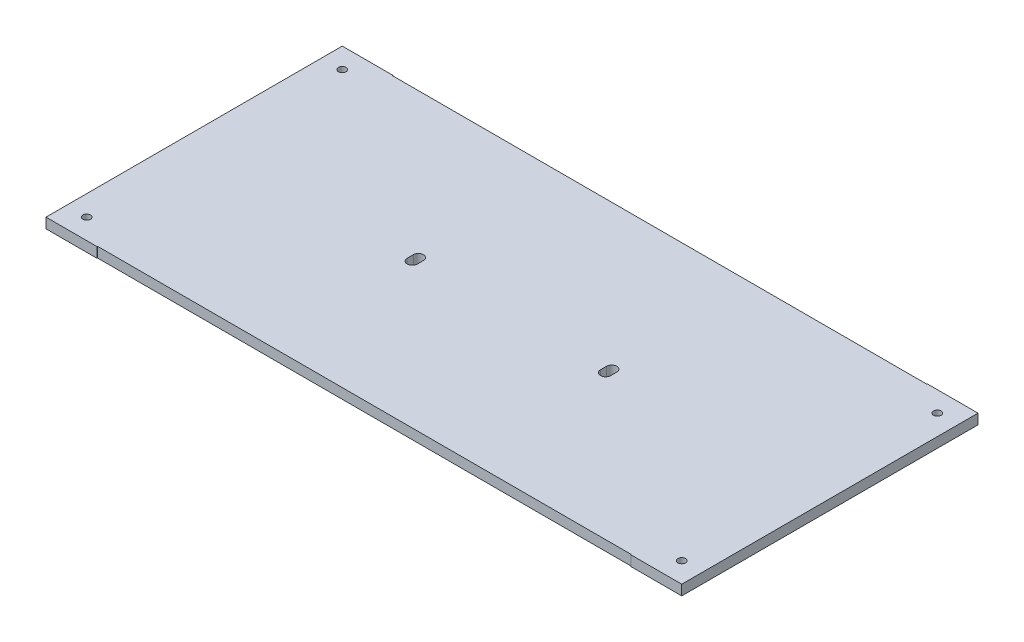
ISO-10303-21;
HEADER;
FILE_DESCRIPTION(('STEP AP214'),'2;1');
FILE_NAME('part.step','',(''),(''),'','','');
FILE_SCHEMA(('AUTOMOTIVE_DESIGN { 1 0 10303 214 1 1 1 1 }'));
ENDSEC;
DATA;
#1=APPLICATION_CONTEXT('core data for automotive mechanical design processes');
#2=APPLICATION_PROTOCOL_DEFINITION('international standard','automotive_design',2000,#1);
#3=PRODUCT_CONTEXT('',#1,'mechanical');
#4=PRODUCT('Part','Part','',(#3));
#5=PRODUCT_RELATED_PRODUCT_CATEGORY('part','',(#4));
#6=PRODUCT_DEFINITION_FORMATION('','',#4);
#7=PRODUCT_DEFINITION_CONTEXT('part definition',#1,'design');
#8=PRODUCT_DEFINITION('design','',#6,#7);
#9=PRODUCT_DEFINITION_SHAPE('','',#8);
#10=(LENGTH_UNIT() NAMED_UNIT(*) SI_UNIT(.MILLI.,.METRE.));
#11=(NAMED_UNIT(*) PLANE_ANGLE_UNIT() SI_UNIT($,.RADIAN.));
#12=(NAMED_UNIT(*) SI_UNIT($,.STERADIAN.) SOLID_ANGLE_UNIT());
#13=UNCERTAINTY_MEASURE_WITH_UNIT(LENGTH_MEASURE(1.E-05),#10,'distance_accuracy_value','');
#14=(GEOMETRIC_REPRESENTATION_CONTEXT(3) GLOBAL_UNCERTAINTY_ASSIGNED_CONTEXT((#13)) GLOBAL_UNIT_ASSIGNED_CONTEXT((#10,
#11,#12)) REPRESENTATION_CONTEXT('',''));
#15=CARTESIAN_POINT('',(0.,0.,0.));
#16=DIRECTION('',(0.,0.,1.));
#17=DIRECTION('',(1.,0.,0.));
#18=AXIS2_PLACEMENT_3D('',#15,#16,#17);
#19=CARTESIAN_POINT('',(250.,41.,-116.497422611929));
#20=DIRECTION('',(0.,-1.,0.));
#21=DIRECTION('',(0.,0.,-1.));
#22=AXIS2_PLACEMENT_3D('',#19,#20,#21);
#23=PLANE('',#22);
#24=DIRECTION('',(0.,0.,1.));
#25=VECTOR('',#24,1.);
#26=CARTESIAN_POINT('',(84.9999999999997,41.,-59.4487113059643));
#27=LINE('',#26,#25);
#28=CARTESIAN_POINT('',(84.9999999999997,41.,-59.4487113059643));
#29=VERTEX_POINT('',#28);
#30=CARTESIAN_POINT('',(84.9999999999997,41.,-57.0487113059643));
#31=VERTEX_POINT('',#30);
#32=EDGE_CURVE('E178',#29,#31,#27,.T.);
#33=ORIENTED_EDGE('',*,*,#32,.F.);
#34=CARTESIAN_POINT('',(86.9999999999997,41.,-59.4487113059643));
#35=DIRECTION('',(0.,-1.,0.));
#36=DIRECTION('',(0.,0.,-1.));
#37=AXIS2_PLACEMENT_3D('',#34,#35,#36);
#38=CIRCLE('',#37,2.00000000000001);
#39=CARTESIAN_POINT('',(88.9999999999997,41.,-59.4487113059643));
#40=VERTEX_POINT('',#39);
#41=EDGE_CURVE('E205',#29,#40,#38,.T.);
#42=ORIENTED_EDGE('',*,*,#41,.T.);
#43=DIRECTION('',(0.,0.,1.));
#44=VECTOR('',#43,1.);
#45=CARTESIAN_POINT('',(88.9999999999997,41.,-59.4487113059643));
#46=LINE('',#45,#44);
#47=CARTESIAN_POINT('',(88.9999999999997,41.,-57.0487113059643));
#48=VERTEX_POINT('',#47);
#49=EDGE_CURVE('E55',#40,#48,#46,.T.);
#50=ORIENTED_EDGE('',*,*,#49,.T.);
#51=CARTESIAN_POINT('',(86.9999999999997,41.,-57.0487113059643));
#52=DIRECTION('',(0.,-1.,0.));
#53=DIRECTION('',(0.,0.,-1.));
#54=AXIS2_PLACEMENT_3D('',#51,#52,#53);
#55=CIRCLE('',#54,2.00000000000001);
#56=EDGE_CURVE('E189',#48,#31,#55,.T.);
#57=ORIENTED_EDGE('',*,*,#56,.T.);
#58=EDGE_LOOP('',(#33,#42,#50,#57));
#59=FACE_BOUND('',#58,.T.);
#60=CARTESIAN_POINT('',(8.00000000000001,41.,-108.497422611929));
#61=DIRECTION('',(0.,-1.,0.));
#62=DIRECTION('',(0.,0.,-1.));
#63=AXIS2_PLACEMENT_3D('',#60,#61,#62);
#64=CIRCLE('',#63,1.5);
#65=CARTESIAN_POINT('',(8.00000000000001,41.,-109.997422611929));
#66=VERTEX_POINT('',#65);
#67=EDGE_CURVE('E242',#66,#66,#64,.T.);
#68=ORIENTED_EDGE('',*,*,#67,.T.);
#69=EDGE_LOOP('',(#68));
#70=FACE_BOUND('',#69,.T.);
#71=CARTESIAN_POINT('',(242.,41.,-8.00000000000001));
#72=DIRECTION('',(0.,-1.,0.));
#73=DIRECTION('',(0.,0.,-1.));
#74=AXIS2_PLACEMENT_3D('',#71,#72,#73);
#75=CIRCLE('',#74,1.5);
#76=CARTESIAN_POINT('',(242.,41.,-9.50000000000001));
#77=VERTEX_POINT('',#76);
#78=EDGE_CURVE('E275',#77,#77,#75,.T.);
#79=ORIENTED_EDGE('',*,*,#78,.T.);
#80=EDGE_LOOP('',(#79));
#81=FACE_BOUND('',#80,.T.);
#82=DIRECTION('',(0.,0.,1.));
#83=VECTOR('',#82,1.);
#84=CARTESIAN_POINT('',(20.,41.,-116.497422611929));
#85=LINE('',#84,#83);
#86=CARTESIAN_POINT('',(20.,41.,-116.497422611929));
#87=VERTEX_POINT('',#86);
#88=CARTESIAN_POINT('',(20.,41.,-116.297422611929));
#89=VERTEX_POINT('',#88);
#90=EDGE_CURVE('E247',#87,#89,#85,.T.);
#91=ORIENTED_EDGE('',*,*,#90,.F.);
#92=DIRECTION('',(-1.,0.,0.));
#93=VECTOR('',#92,1.);
#94=CARTESIAN_POINT('',(250.,41.,-116.497422611929));
#95=LINE('',#94,#93);
#96=CARTESIAN_POINT('',(0.,41.,-116.497422611929));
#97=VERTEX_POINT('',#96);
#98=EDGE_CURVE('E364',#87,#97,#95,.T.);
#99=ORIENTED_EDGE('',*,*,#98,.T.);
#100=DIRECTION('',(0.,0.,1.));
#101=VECTOR('',#100,1.);
#102=CARTESIAN_POINT('',(0.,41.,-116.497422611929));
#103=LINE('',#102,#101);
#104=CARTESIAN_POINT('',(0.,41.,0.));
#105=VERTEX_POINT('',#104);
#106=EDGE_CURVE('E339',#97,#105,#103,.T.);
#107=ORIENTED_EDGE('',*,*,#106,.T.);
#108=DIRECTION('',(-1.,0.,0.));
#109=VECTOR('',#108,1.);
#110=CARTESIAN_POINT('',(250.,41.,0.));
#111=LINE('',#110,#109);
#112=CARTESIAN_POINT('',(20.,41.,0.));
#113=VERTEX_POINT('',#112);
#114=EDGE_CURVE('E359',#113,#105,#111,.T.);
#115=ORIENTED_EDGE('',*,*,#114,.F.);
#116=DIRECTION('',(0.,0.,-1.));
#117=VECTOR('',#116,1.);
#118=CARTESIAN_POINT('',(20.,41.,-116.497422611929));
#119=LINE('',#118,#117);
#120=CARTESIAN_POINT('',(20.,41.,-0.200000000000006));
#121=VERTEX_POINT('',#120);
#122=EDGE_CURVE('E288',#113,#121,#119,.T.);
#123=ORIENTED_EDGE('',*,*,#122,.T.);
#124=DIRECTION('',(1.,0.,0.));
#125=VECTOR('',#124,1.);
#126=CARTESIAN_POINT('',(250.,41.,-0.200000000000006));
#127=LINE('',#126,#125);
#128=CARTESIAN_POINT('',(230.,41.,-0.200000000000006));
#129=VERTEX_POINT('',#128);
#130=EDGE_CURVE('E300',#121,#129,#127,.T.);
#131=ORIENTED_EDGE('',*,*,#130,.T.);
#132=DIRECTION('',(0.,0.,-1.));
#133=VECTOR('',#132,1.);
#134=CARTESIAN_POINT('',(230.,41.,-116.497422611929));
#135=LINE('',#134,#133);
#136=CARTESIAN_POINT('',(230.,41.,0.));
#137=VERTEX_POINT('',#136);
#138=EDGE_CURVE('E296',#137,#129,#135,.T.);
#139=ORIENTED_EDGE('',*,*,#138,.F.);
#140=CARTESIAN_POINT('',(250.,41.,0.));
#141=VERTEX_POINT('',#140);
#142=EDGE_CURVE('E360',#141,#137,#111,.T.);
#143=ORIENTED_EDGE('',*,*,#142,.F.);
#144=DIRECTION('',(0.,0.,1.));
#145=VECTOR('',#144,1.);
#146=CARTESIAN_POINT('',(250.,41.,-116.497422611929));
#147=LINE('',#146,#145);
#148=CARTESIAN_POINT('',(250.,41.,-116.497422611929));
#149=VERTEX_POINT('',#148);
#150=EDGE_CURVE('E325',#149,#141,#147,.T.);
#151=ORIENTED_EDGE('',*,*,#150,.F.);
#152=CARTESIAN_POINT('',(230.,41.,-116.497422611929));
#153=VERTEX_POINT('',#152);
#154=EDGE_CURVE('E365',#149,#153,#95,.T.);
#155=ORIENTED_EDGE('',*,*,#154,.T.);
#156=DIRECTION('',(0.,0.,1.));
#157=VECTOR('',#156,1.);
#158=CARTESIAN_POINT('',(230.,41.,-116.497422611929));
#159=LINE('',#158,#157);
#160=CARTESIAN_POINT('',(230.,41.,-116.297422611929));
#161=VERTEX_POINT('',#160);
#162=EDGE_CURVE('E262',#153,#161,#159,.T.);
#163=ORIENTED_EDGE('',*,*,#162,.T.);
#164=DIRECTION('',(1.,0.,0.));
#165=VECTOR('',#164,1.);
#166=CARTESIAN_POINT('',(20.,41.,-116.297422611929));
#167=LINE('',#166,#165);
#168=EDGE_CURVE('E266',#89,#161,#167,.T.);
#169=ORIENTED_EDGE('',*,*,#168,.F.);
#170=EDGE_LOOP('',(#91,#99,#107,#115,#123,#131,#139,#143,#151,#155,#163,#169));
#171=FACE_BOUND('',#170,.T.);
#172=CARTESIAN_POINT('',(8.00000000000001,41.,-8.00000000000001));
#173=DIRECTION('',(0.,1.,0.));
#174=DIRECTION('',(0.,0.,1.));
#175=AXIS2_PLACEMENT_3D('',#172,#173,#174);
#176=CIRCLE('',#175,1.5);
#177=CARTESIAN_POINT('',(8.00000000000001,41.,-6.50000000000001));
#178=VERTEX_POINT('',#177);
#179=EDGE_CURVE('E246',#178,#178,#176,.T.);
#180=ORIENTED_EDGE('',*,*,#179,.F.);
#181=EDGE_LOOP('',(#180));
#182=FACE_BOUND('',#181,.T.);
#183=CARTESIAN_POINT('',(242.,41.,-108.497422611929));
#184=DIRECTION('',(0.,1.,0.));
#185=DIRECTION('',(0.,0.,1.));
#186=AXIS2_PLACEMENT_3D('',#183,#184,#185);
#187=CIRCLE('',#186,1.5);
#188=CARTESIAN_POINT('',(242.,41.,-106.997422611929));
#189=VERTEX_POINT('',#188);
#190=EDGE_CURVE('E271',#189,#189,#187,.T.);
#191=ORIENTED_EDGE('',*,*,#190,.F.);
#192=EDGE_LOOP('',(#191));
#193=FACE_BOUND('',#192,.T.);
#194=CARTESIAN_POINT('',(163.,41.,-59.4487113059643));
#195=DIRECTION('',(0.,1.,0.));
#196=DIRECTION('',(0.,0.,1.));
#197=AXIS2_PLACEMENT_3D('',#194,#195,#196);
#198=CIRCLE('',#197,2.);
#199=CARTESIAN_POINT('',(165.,41.,-59.4487113059643));
#200=VERTEX_POINT('',#199);
#201=CARTESIAN_POINT('',(161.,41.,-59.4487113059643));
#202=VERTEX_POINT('',#201);
#203=EDGE_CURVE('E220',#200,#202,#198,.T.);
#204=ORIENTED_EDGE('',*,*,#203,.F.);
#205=DIRECTION('',(0.,0.,1.));
#206=VECTOR('',#205,1.);
#207=CARTESIAN_POINT('',(165.,41.,-59.4487113059643));
#208=LINE('',#207,#206);
#209=CARTESIAN_POINT('',(165.,41.,-57.0487113059643));
#210=VERTEX_POINT('',#209);
#211=EDGE_CURVE('E190',#200,#210,#208,.T.);
#212=ORIENTED_EDGE('',*,*,#211,.T.);
#213=CARTESIAN_POINT('',(163.,41.,-57.0487113059643));
#214=DIRECTION('',(0.,1.,0.));
#215=DIRECTION('',(0.,0.,1.));
#216=AXIS2_PLACEMENT_3D('',#213,#214,#215);
#217=CIRCLE('',#216,2.);
#218=CARTESIAN_POINT('',(161.,41.,-57.0487113059643));
#219=VERTEX_POINT('',#218);
#220=EDGE_CURVE('E236',#219,#210,#217,.T.);
#221=ORIENTED_EDGE('',*,*,#220,.F.);
#222=DIRECTION('',(0.,0.,1.));
#223=VECTOR('',#222,1.);
#224=CARTESIAN_POINT('',(161.,41.,-59.4487113059643));
#225=LINE('',#224,#223);
#226=EDGE_CURVE('E233',#202,#219,#225,.T.);
#227=ORIENTED_EDGE('',*,*,#226,.F.);
#228=EDGE_LOOP('',(#204,#212,#221,#227));
#229=FACE_BOUND('',#228,.T.);
#230=ADVANCED_FACE('F39',(#59,#70,#81,#171,#182,#193,#229),#23,.F.);
#231=CARTESIAN_POINT('',(250.,37.,-116.497422611929));
#232=DIRECTION('',(0.,1.,0.));
#233=DIRECTION('',(0.,0.,1.));
#234=AXIS2_PLACEMENT_3D('',#231,#232,#233);
#235=PLANE('',#234);
#236=DIRECTION('',(0.,0.,-1.));
#237=VECTOR('',#236,1.);
#238=CARTESIAN_POINT('',(84.9999999999997,37.,-116.497422611929));
#239=LINE('',#238,#237);
#240=CARTESIAN_POINT('',(84.9999999999997,37.,-57.0487113059643));
#241=VERTEX_POINT('',#240);
#242=CARTESIAN_POINT('',(84.9999999999997,37.,-59.4487113059643));
#243=VERTEX_POINT('',#242);
#244=EDGE_CURVE('E11',#241,#243,#239,.T.);
#245=ORIENTED_EDGE('',*,*,#244,.F.);
#246=CARTESIAN_POINT('',(86.9999999999997,37.,-57.0487113059643));
#247=DIRECTION('',(0.,1.,0.));
#248=DIRECTION('',(0.,0.,1.));
#249=AXIS2_PLACEMENT_3D('',#246,#247,#248);
#250=CIRCLE('',#249,2.00000000000001);
#251=CARTESIAN_POINT('',(88.9999999999997,37.,-57.0487113059643));
#252=VERTEX_POINT('',#251);
#253=EDGE_CURVE('E48',#241,#252,#250,.T.);
#254=ORIENTED_EDGE('',*,*,#253,.T.);
#255=DIRECTION('',(0.,0.,-1.));
#256=VECTOR('',#255,1.);
#257=CARTESIAN_POINT('',(88.9999999999997,37.,-116.497422611929));
#258=LINE('',#257,#256);
#259=CARTESIAN_POINT('',(88.9999999999997,37.,-59.4487113059643));
#260=VERTEX_POINT('',#259);
#261=EDGE_CURVE('E410',#252,#260,#258,.T.);
#262=ORIENTED_EDGE('',*,*,#261,.T.);
#263=CARTESIAN_POINT('',(86.9999999999997,37.,-59.4487113059643));
#264=DIRECTION('',(0.,1.,0.));
#265=DIRECTION('',(0.,0.,1.));
#266=AXIS2_PLACEMENT_3D('',#263,#264,#265);
#267=CIRCLE('',#266,2.00000000000001);
#268=EDGE_CURVE('E406',#260,#243,#267,.T.);
#269=ORIENTED_EDGE('',*,*,#268,.T.);
#270=EDGE_LOOP('',(#245,#254,#262,#269));
#271=FACE_BOUND('',#270,.T.);
#272=CARTESIAN_POINT('',(8.00000000000001,37.,-108.497422611929));
#273=DIRECTION('',(0.,1.,0.));
#274=DIRECTION('',(0.,0.,1.));
#275=AXIS2_PLACEMENT_3D('',#272,#273,#274);
#276=CIRCLE('',#275,1.5);
#277=CARTESIAN_POINT('',(8.00000000000001,37.,-106.997422611929));
#278=VERTEX_POINT('',#277);
#279=EDGE_CURVE('E373',#278,#278,#276,.T.);
#280=ORIENTED_EDGE('',*,*,#279,.T.);
#281=EDGE_LOOP('',(#280));
#282=FACE_BOUND('',#281,.T.);
#283=CARTESIAN_POINT('',(242.,37.,-8.00000000000001));
#284=DIRECTION('',(0.,1.,0.));
#285=DIRECTION('',(0.,0.,1.));
#286=AXIS2_PLACEMENT_3D('',#283,#284,#285);
#287=CIRCLE('',#286,1.5);
#288=CARTESIAN_POINT('',(242.,37.,-6.50000000000001));
#289=VERTEX_POINT('',#288);
#290=EDGE_CURVE('E282',#289,#289,#287,.T.);
#291=ORIENTED_EDGE('',*,*,#290,.T.);
#292=EDGE_LOOP('',(#291));
#293=FACE_BOUND('',#292,.T.);
#294=DIRECTION('',(0.,0.,-1.));
#295=VECTOR('',#294,1.);
#296=CARTESIAN_POINT('',(20.,37.,-116.497422611929));
#297=LINE('',#296,#295);
#298=CARTESIAN_POINT('',(20.,37.,-116.297422611929));
#299=VERTEX_POINT('',#298);
#300=CARTESIAN_POINT('',(20.,37.,-116.497422611929));
#301=VERTEX_POINT('',#300);
#302=EDGE_CURVE('E380',#299,#301,#297,.T.);
#303=ORIENTED_EDGE('',*,*,#302,.F.);
#304=DIRECTION('',(-1.,0.,0.));
#305=VECTOR('',#304,1.);
#306=CARTESIAN_POINT('',(250.,37.,-116.297422611929));
#307=LINE('',#306,#305);
#308=CARTESIAN_POINT('',(230.,37.,-116.297422611929));
#309=VERTEX_POINT('',#308);
#310=EDGE_CURVE('E377',#309,#299,#307,.T.);
#311=ORIENTED_EDGE('',*,*,#310,.F.);
#312=DIRECTION('',(0.,0.,-1.));
#313=VECTOR('',#312,1.);
#314=CARTESIAN_POINT('',(230.,37.,-116.497422611929));
#315=LINE('',#314,#313);
#316=CARTESIAN_POINT('',(230.,37.,-116.497422611929));
#317=VERTEX_POINT('',#316);
#318=EDGE_CURVE('E369',#309,#317,#315,.T.);
#319=ORIENTED_EDGE('',*,*,#318,.T.);
#320=DIRECTION('',(-1.,0.,0.));
#321=VECTOR('',#320,1.);
#322=CARTESIAN_POINT('',(250.,37.,-116.497422611929));
#323=LINE('',#322,#321);
#324=CARTESIAN_POINT('',(250.,37.,-116.497422611929));
#325=VERTEX_POINT('',#324);
#326=EDGE_CURVE('E350',#325,#317,#323,.T.);
#327=ORIENTED_EDGE('',*,*,#326,.F.);
#328=DIRECTION('',(0.,0.,-1.));
#329=VECTOR('',#328,1.);
#330=CARTESIAN_POINT('',(250.,37.,-116.497422611929));
#331=LINE('',#330,#329);
#332=CARTESIAN_POINT('',(250.,37.,0.));
#333=VERTEX_POINT('',#332);
#334=EDGE_CURVE('E332',#333,#325,#331,.T.);
#335=ORIENTED_EDGE('',*,*,#334,.F.);
#336=DIRECTION('',(-1.,0.,0.));
#337=VECTOR('',#336,1.);
#338=CARTESIAN_POINT('',(250.,37.,0.));
#339=LINE('',#338,#337);
#340=CARTESIAN_POINT('',(230.,37.,0.));
#341=VERTEX_POINT('',#340);
#342=EDGE_CURVE('E355',#333,#341,#339,.T.);
#343=ORIENTED_EDGE('',*,*,#342,.T.);
#344=DIRECTION('',(0.,0.,-1.));
#345=VECTOR('',#344,1.);
#346=CARTESIAN_POINT('',(230.,37.,-116.497422611929));
#347=LINE('',#346,#345);
#348=CARTESIAN_POINT('',(230.,37.,-0.200000000000006));
#349=VERTEX_POINT('',#348);
#350=EDGE_CURVE('E283',#341,#349,#347,.T.);
#351=ORIENTED_EDGE('',*,*,#350,.T.);
#352=DIRECTION('',(1.,0.,0.));
#353=VECTOR('',#352,1.);
#354=CARTESIAN_POINT('',(250.,37.,-0.200000000000006));
#355=LINE('',#354,#353);
#356=CARTESIAN_POINT('',(20.,37.,-0.200000000000006));
#357=VERTEX_POINT('',#356);
#358=EDGE_CURVE('E287',#357,#349,#355,.T.);
#359=ORIENTED_EDGE('',*,*,#358,.F.);
#360=DIRECTION('',(0.,0.,-1.));
#361=VECTOR('',#360,1.);
#362=CARTESIAN_POINT('',(20.,37.,-116.497422611929));
#363=LINE('',#362,#361);
#364=CARTESIAN_POINT('',(20.,37.,0.));
#365=VERTEX_POINT('',#364);
#366=EDGE_CURVE('E291',#365,#357,#363,.T.);
#367=ORIENTED_EDGE('',*,*,#366,.F.);
#368=CARTESIAN_POINT('',(0.,37.,0.));
#369=VERTEX_POINT('',#368);
#370=EDGE_CURVE('E354',#365,#369,#339,.T.);
#371=ORIENTED_EDGE('',*,*,#370,.T.);
#372=DIRECTION('',(0.,0.,-1.));
#373=VECTOR('',#372,1.);
#374=CARTESIAN_POINT('',(0.,37.,-116.497422611929));
#375=LINE('',#374,#373);
#376=CARTESIAN_POINT('',(0.,37.,-116.497422611929));
#377=VERTEX_POINT('',#376);
#378=EDGE_CURVE('E326',#369,#377,#375,.T.);
#379=ORIENTED_EDGE('',*,*,#378,.T.);
#380=EDGE_CURVE('E335',#301,#377,#323,.T.);
#381=ORIENTED_EDGE('',*,*,#380,.F.);
#382=EDGE_LOOP('',(#303,#311,#319,#327,#335,#343,#351,#359,#367,#371,#379,#381));
#383=FACE_BOUND('',#382,.T.);
#384=CARTESIAN_POINT('',(8.00000000000001,37.,-8.00000000000001));
#385=DIRECTION('',(0.,1.,0.));
#386=DIRECTION('',(0.,0.,1.));
#387=AXIS2_PLACEMENT_3D('',#384,#385,#386);
#388=CIRCLE('',#387,1.5);
#389=CARTESIAN_POINT('',(8.00000000000001,37.,-6.50000000000001));
#390=VERTEX_POINT('',#389);
#391=EDGE_CURVE('E387',#390,#390,#388,.F.);
#392=ORIENTED_EDGE('',*,*,#391,.F.);
#393=EDGE_LOOP('',(#392));
#394=FACE_BOUND('',#393,.T.);
#395=CARTESIAN_POINT('',(242.,37.,-108.497422611929));
#396=DIRECTION('',(0.,1.,0.));
#397=DIRECTION('',(0.,0.,1.));
#398=AXIS2_PLACEMENT_3D('',#395,#396,#397);
#399=CIRCLE('',#398,1.5);
#400=CARTESIAN_POINT('',(242.,37.,-106.997422611929));
#401=VERTEX_POINT('',#400);
#402=EDGE_CURVE('E301',#401,#401,#399,.F.);
#403=ORIENTED_EDGE('',*,*,#402,.F.);
#404=EDGE_LOOP('',(#403));
#405=FACE_BOUND('',#404,.T.);
#406=CARTESIAN_POINT('',(163.,37.,-57.0487113059643));
#407=DIRECTION('',(0.,1.,0.));
#408=DIRECTION('',(0.,0.,1.));
#409=AXIS2_PLACEMENT_3D('',#406,#407,#408);
#410=CIRCLE('',#409,2.);
#411=CARTESIAN_POINT('',(165.,37.,-57.0487113059643));
#412=VERTEX_POINT('',#411);
#413=CARTESIAN_POINT('',(161.,37.,-57.0487113059643));
#414=VERTEX_POINT('',#413);
#415=EDGE_CURVE('E383',#412,#414,#410,.F.);
#416=ORIENTED_EDGE('',*,*,#415,.F.);
#417=DIRECTION('',(0.,0.,-1.));
#418=VECTOR('',#417,1.);
#419=CARTESIAN_POINT('',(165.,37.,-116.497422611929));
#420=LINE('',#419,#418);
#421=CARTESIAN_POINT('',(165.,37.,-59.4487113059643));
#422=VERTEX_POINT('',#421);
#423=EDGE_CURVE('E402',#412,#422,#420,.T.);
#424=ORIENTED_EDGE('',*,*,#423,.T.);
#425=CARTESIAN_POINT('',(163.,37.,-59.4487113059643));
#426=DIRECTION('',(0.,1.,0.));
#427=DIRECTION('',(0.,0.,1.));
#428=AXIS2_PLACEMENT_3D('',#425,#426,#427);
#429=CIRCLE('',#428,2.);
#430=CARTESIAN_POINT('',(161.,37.,-59.4487113059643));
#431=VERTEX_POINT('',#430);
#432=EDGE_CURVE('E399',#431,#422,#429,.F.);
#433=ORIENTED_EDGE('',*,*,#432,.F.);
#434=DIRECTION('',(0.,0.,-1.));
#435=VECTOR('',#434,1.);
#436=CARTESIAN_POINT('',(161.,37.,-116.497422611929));
#437=LINE('',#436,#435);
#438=EDGE_CURVE('E396',#414,#431,#437,.T.);
#439=ORIENTED_EDGE('',*,*,#438,.F.);
#440=EDGE_LOOP('',(#416,#424,#433,#439));
#441=FACE_BOUND('',#440,.T.);
#442=ADVANCED_FACE('F415',(#271,#282,#293,#383,#394,#405,#441),#235,.F.);
#443=CARTESIAN_POINT('',(250.,41.,-116.497422611929));
#444=DIRECTION('',(0.,0.,1.));
#445=DIRECTION('',(0.,-1.,0.));
#446=AXIS2_PLACEMENT_3D('',#443,#444,#445);
#447=PLANE('',#446);
#448=DIRECTION('',(0.,-1.,0.));
#449=VECTOR('',#448,1.);
#450=CARTESIAN_POINT('',(20.,41.,-116.497422611929));
#451=LINE('',#450,#449);
#452=EDGE_CURVE('E258',#87,#301,#451,.T.);
#453=ORIENTED_EDGE('',*,*,#452,.T.);
#454=ORIENTED_EDGE('',*,*,#380,.T.);
#455=DIRECTION('',(0.,1.,0.));
#456=VECTOR('',#455,1.);
#457=CARTESIAN_POINT('',(0.,41.,-116.497422611929));
#458=LINE('',#457,#456);
#459=EDGE_CURVE('E311',#377,#97,#458,.T.);
#460=ORIENTED_EDGE('',*,*,#459,.T.);
#461=ORIENTED_EDGE('',*,*,#98,.F.);
#462=EDGE_LOOP('',(#453,#454,#460,#461));
#463=FACE_BOUND('',#462,.T.);
#464=ADVANCED_FACE('F433',(#463),#447,.F.);
#465=CARTESIAN_POINT('',(250.,41.,0.));
#466=DIRECTION('',(0.,0.,-1.));
#467=DIRECTION('',(-1.,0.,0.));
#468=AXIS2_PLACEMENT_3D('',#465,#466,#467);
#469=PLANE('',#468);
#470=DIRECTION('',(0.,1.,0.));
#471=VECTOR('',#470,1.);
#472=CARTESIAN_POINT('',(20.,37.,0.));
#473=LINE('',#472,#471);
#474=EDGE_CURVE('E312',#365,#113,#473,.T.);
#475=ORIENTED_EDGE('',*,*,#474,.T.);
#476=ORIENTED_EDGE('',*,*,#114,.T.);
#477=DIRECTION('',(0.,-1.,0.));
#478=VECTOR('',#477,1.);
#479=CARTESIAN_POINT('',(0.,41.,0.));
#480=LINE('',#479,#478);
#481=EDGE_CURVE('E343',#105,#369,#480,.T.);
#482=ORIENTED_EDGE('',*,*,#481,.T.);
#483=ORIENTED_EDGE('',*,*,#370,.F.);
#484=EDGE_LOOP('',(#475,#476,#482,#483));
#485=FACE_BOUND('',#484,.T.);
#486=ADVANCED_FACE('F440',(#485),#469,.F.);
#487=ORIENTED_EDGE('',*,*,#326,.T.);
#488=DIRECTION('',(0.,-1.,0.));
#489=VECTOR('',#488,1.);
#490=CARTESIAN_POINT('',(230.,41.,-116.497422611929));
#491=LINE('',#490,#489);
#492=EDGE_CURVE('E255',#153,#317,#491,.T.);
#493=ORIENTED_EDGE('',*,*,#492,.F.);
#494=ORIENTED_EDGE('',*,*,#154,.F.);
#495=DIRECTION('',(0.,1.,0.));
#496=VECTOR('',#495,1.);
#497=CARTESIAN_POINT('',(250.,41.,-116.497422611929));
#498=LINE('',#497,#496);
#499=EDGE_CURVE('E321',#325,#149,#498,.T.);
#500=ORIENTED_EDGE('',*,*,#499,.F.);
#501=EDGE_LOOP('',(#487,#493,#494,#500));
#502=FACE_BOUND('',#501,.T.);
#503=ADVANCED_FACE('F41',(#502),#447,.F.);
#504=ORIENTED_EDGE('',*,*,#142,.T.);
#505=DIRECTION('',(0.,1.,0.));
#506=VECTOR('',#505,1.);
#507=CARTESIAN_POINT('',(230.,37.,0.));
#508=LINE('',#507,#506);
#509=EDGE_CURVE('E308',#341,#137,#508,.T.);
#510=ORIENTED_EDGE('',*,*,#509,.F.);
#511=ORIENTED_EDGE('',*,*,#342,.F.);
#512=DIRECTION('',(0.,-1.,0.));
#513=VECTOR('',#512,1.);
#514=CARTESIAN_POINT('',(250.,41.,0.));
#515=LINE('',#514,#513);
#516=EDGE_CURVE('E329',#141,#333,#515,.T.);
#517=ORIENTED_EDGE('',*,*,#516,.F.);
#518=EDGE_LOOP('',(#504,#510,#511,#517));
#519=FACE_BOUND('',#518,.T.);
#520=ADVANCED_FACE('F436',(#519),#469,.F.);
#521=CARTESIAN_POINT('',(250.,0.,0.));
#522=DIRECTION('',(-1.,0.,0.));
#523=DIRECTION('',(0.,0.,1.));
#524=AXIS2_PLACEMENT_3D('',#521,#522,#523);
#525=PLANE('',#524);
#526=ORIENTED_EDGE('',*,*,#499,.T.);
#527=ORIENTED_EDGE('',*,*,#150,.T.);
#528=ORIENTED_EDGE('',*,*,#516,.T.);
#529=ORIENTED_EDGE('',*,*,#334,.T.);
#530=EDGE_LOOP('',(#526,#527,#528,#529));
#531=FACE_BOUND('',#530,.T.);
#532=ADVANCED_FACE('F438',(#531),#525,.F.);
#533=CARTESIAN_POINT('',(0.,0.,0.));
#534=DIRECTION('',(-1.,0.,0.));
#535=DIRECTION('',(0.,0.,1.));
#536=AXIS2_PLACEMENT_3D('',#533,#534,#535);
#537=PLANE('',#536);
#538=ORIENTED_EDGE('',*,*,#459,.F.);
#539=ORIENTED_EDGE('',*,*,#378,.F.);
#540=ORIENTED_EDGE('',*,*,#481,.F.);
#541=ORIENTED_EDGE('',*,*,#106,.F.);
#542=EDGE_LOOP('',(#538,#539,#540,#541));
#543=FACE_BOUND('',#542,.T.);
#544=ADVANCED_FACE('F442',(#543),#537,.T.);
#545=CARTESIAN_POINT('',(230.,37.,-116.497422611929));
#546=DIRECTION('',(1.,0.,0.));
#547=DIRECTION('',(0.,0.,-1.));
#548=AXIS2_PLACEMENT_3D('',#545,#546,#547);
#549=PLANE('',#548);
#550=ORIENTED_EDGE('',*,*,#138,.T.);
#551=DIRECTION('',(0.,1.,0.));
#552=VECTOR('',#551,1.);
#553=CARTESIAN_POINT('',(230.,37.,-0.200000000000006));
#554=LINE('',#553,#552);
#555=EDGE_CURVE('E295',#349,#129,#554,.T.);
#556=ORIENTED_EDGE('',*,*,#555,.F.);
#557=ORIENTED_EDGE('',*,*,#350,.F.);
#558=ORIENTED_EDGE('',*,*,#509,.T.);
#559=EDGE_LOOP('',(#550,#556,#557,#558));
#560=FACE_BOUND('',#559,.T.);
#561=ADVANCED_FACE('F445',(#560),#549,.F.);
#562=CARTESIAN_POINT('',(20.,37.,-116.497422611929));
#563=DIRECTION('',(1.,0.,0.));
#564=DIRECTION('',(0.,0.,-1.));
#565=AXIS2_PLACEMENT_3D('',#562,#563,#564);
#566=PLANE('',#565);
#567=ORIENTED_EDGE('',*,*,#122,.F.);
#568=ORIENTED_EDGE('',*,*,#474,.F.);
#569=ORIENTED_EDGE('',*,*,#366,.T.);
#570=DIRECTION('',(0.,1.,0.));
#571=VECTOR('',#570,1.);
#572=CARTESIAN_POINT('',(20.,37.,-0.200000000000006));
#573=LINE('',#572,#571);
#574=EDGE_CURVE('E316',#357,#121,#573,.T.);
#575=ORIENTED_EDGE('',*,*,#574,.T.);
#576=EDGE_LOOP('',(#567,#568,#569,#575));
#577=FACE_BOUND('',#576,.T.);
#578=ADVANCED_FACE('F452',(#577),#566,.T.);
#579=CARTESIAN_POINT('',(250.,37.,-0.200000000000006));
#580=DIRECTION('',(0.,0.,1.));
#581=DIRECTION('',(1.,0.,0.));
#582=AXIS2_PLACEMENT_3D('',#579,#580,#581);
#583=PLANE('',#582);
#584=ORIENTED_EDGE('',*,*,#130,.F.);
#585=ORIENTED_EDGE('',*,*,#574,.F.);
#586=ORIENTED_EDGE('',*,*,#358,.T.);
#587=ORIENTED_EDGE('',*,*,#555,.T.);
#588=EDGE_LOOP('',(#584,#585,#586,#587));
#589=FACE_BOUND('',#588,.T.);
#590=ADVANCED_FACE('F454',(#589),#583,.T.);
#591=CARTESIAN_POINT('',(242.,41.,-8.00000000000001));
#592=DIRECTION('',(0.,-1.,0.));
#593=DIRECTION('',(0.,0.,-1.));
#594=AXIS2_PLACEMENT_3D('',#591,#592,#593);
#595=CYLINDRICAL_SURFACE('',#594,1.5);
#596=ORIENTED_EDGE('',*,*,#78,.F.);
#597=EDGE_LOOP('',(#596));
#598=FACE_BOUND('',#597,.T.);
#599=ORIENTED_EDGE('',*,*,#290,.F.);
#600=EDGE_LOOP('',(#599));
#601=FACE_BOUND('',#600,.T.);
#602=ADVANCED_FACE('F457',(#598,#601),#595,.F.);
#603=CARTESIAN_POINT('',(20.,41.,-116.497422611929));
#604=DIRECTION('',(1.,0.,0.));
#605=DIRECTION('',(0.,0.,-1.));
#606=AXIS2_PLACEMENT_3D('',#603,#604,#605);
#607=PLANE('',#606);
#608=ORIENTED_EDGE('',*,*,#302,.T.);
#609=ORIENTED_EDGE('',*,*,#452,.F.);
#610=ORIENTED_EDGE('',*,*,#90,.T.);
#611=DIRECTION('',(0.,-1.,0.));
#612=VECTOR('',#611,1.);
#613=CARTESIAN_POINT('',(20.,41.,-116.297422611929));
#614=LINE('',#613,#612);
#615=EDGE_CURVE('E198',#89,#299,#614,.T.);
#616=ORIENTED_EDGE('',*,*,#615,.T.);
#617=EDGE_LOOP('',(#608,#609,#610,#616));
#618=FACE_BOUND('',#617,.T.);
#619=ADVANCED_FACE('F464',(#618),#607,.T.);
#620=CARTESIAN_POINT('',(20.,41.,-116.297422611929));
#621=DIRECTION('',(0.,0.,-1.));
#622=DIRECTION('',(-1.,0.,0.));
#623=AXIS2_PLACEMENT_3D('',#620,#621,#622);
#624=PLANE('',#623);
#625=ORIENTED_EDGE('',*,*,#310,.T.);
#626=ORIENTED_EDGE('',*,*,#615,.F.);
#627=ORIENTED_EDGE('',*,*,#168,.T.);
#628=DIRECTION('',(0.,-1.,0.));
#629=VECTOR('',#628,1.);
#630=CARTESIAN_POINT('',(230.,41.,-116.297422611929));
#631=LINE('',#630,#629);
#632=EDGE_CURVE('E251',#161,#309,#631,.T.);
#633=ORIENTED_EDGE('',*,*,#632,.T.);
#634=EDGE_LOOP('',(#625,#626,#627,#633));
#635=FACE_BOUND('',#634,.T.);
#636=ADVANCED_FACE('F479',(#635),#624,.T.);
#637=CARTESIAN_POINT('',(230.,41.,-116.497422611929));
#638=DIRECTION('',(1.,0.,0.));
#639=DIRECTION('',(0.,0.,-1.));
#640=AXIS2_PLACEMENT_3D('',#637,#638,#639);
#641=PLANE('',#640);
#642=ORIENTED_EDGE('',*,*,#632,.F.);
#643=ORIENTED_EDGE('',*,*,#162,.F.);
#644=ORIENTED_EDGE('',*,*,#492,.T.);
#645=ORIENTED_EDGE('',*,*,#318,.F.);
#646=EDGE_LOOP('',(#642,#643,#644,#645));
#647=FACE_BOUND('',#646,.T.);
#648=ADVANCED_FACE('F476',(#647),#641,.F.);
#649=CARTESIAN_POINT('',(8.00000000000001,41.,-108.497422611929));
#650=DIRECTION('',(0.,-1.,0.));
#651=DIRECTION('',(0.,0.,-1.));
#652=AXIS2_PLACEMENT_3D('',#649,#650,#651);
#653=CYLINDRICAL_SURFACE('',#652,1.5);
#654=ORIENTED_EDGE('',*,*,#67,.F.);
#655=EDGE_LOOP('',(#654));
#656=FACE_BOUND('',#655,.T.);
#657=ORIENTED_EDGE('',*,*,#279,.F.);
#658=EDGE_LOOP('',(#657));
#659=FACE_BOUND('',#658,.T.);
#660=ADVANCED_FACE('F470',(#656,#659),#653,.F.);
#661=CARTESIAN_POINT('',(8.00000000000001,41.,-8.00000000000001));
#662=DIRECTION('',(0.,-1.,0.));
#663=DIRECTION('',(0.,0.,-1.));
#664=AXIS2_PLACEMENT_3D('',#661,#662,#663);
#665=CYLINDRICAL_SURFACE('',#664,1.5);
#666=ORIENTED_EDGE('',*,*,#179,.T.);
#667=EDGE_LOOP('',(#666));
#668=FACE_BOUND('',#667,.T.);
#669=ORIENTED_EDGE('',*,*,#391,.T.);
#670=EDGE_LOOP('',(#669));
#671=FACE_BOUND('',#670,.T.);
#672=ADVANCED_FACE('F466',(#668,#671),#665,.F.);
#673=CARTESIAN_POINT('',(242.,41.,-108.497422611929));
#674=DIRECTION('',(0.,-1.,0.));
#675=DIRECTION('',(0.,0.,-1.));
#676=AXIS2_PLACEMENT_3D('',#673,#674,#675);
#677=CYLINDRICAL_SURFACE('',#676,1.5);
#678=ORIENTED_EDGE('',*,*,#190,.T.);
#679=EDGE_LOOP('',(#678));
#680=FACE_BOUND('',#679,.T.);
#681=ORIENTED_EDGE('',*,*,#402,.T.);
#682=EDGE_LOOP('',(#681));
#683=FACE_BOUND('',#682,.T.);
#684=ADVANCED_FACE('F469',(#680,#683),#677,.F.);
#685=CARTESIAN_POINT('',(165.,41.,-59.4487113059643));
#686=DIRECTION('',(1.,0.,0.));
#687=DIRECTION('',(0.,0.,-1.));
#688=AXIS2_PLACEMENT_3D('',#685,#686,#687);
#689=PLANE('',#688);
#690=DIRECTION('',(0.,-1.,0.));
#691=VECTOR('',#690,1.);
#692=CARTESIAN_POINT('',(165.,41.,-57.0487113059643));
#693=LINE('',#692,#691);
#694=EDGE_CURVE('E217',#210,#412,#693,.T.);
#695=ORIENTED_EDGE('',*,*,#694,.F.);
#696=ORIENTED_EDGE('',*,*,#211,.F.);
#697=DIRECTION('',(0.,-1.,0.));
#698=VECTOR('',#697,1.);
#699=CARTESIAN_POINT('',(165.,41.,-59.4487113059643));
#700=LINE('',#699,#698);
#701=EDGE_CURVE('E227',#200,#422,#700,.T.);
#702=ORIENTED_EDGE('',*,*,#701,.T.);
#703=ORIENTED_EDGE('',*,*,#423,.F.);
#704=EDGE_LOOP('',(#695,#696,#702,#703));
#705=FACE_BOUND('',#704,.T.);
#706=ADVANCED_FACE('F474',(#705),#689,.F.);
#707=CARTESIAN_POINT('',(163.,41.,-59.4487113059643));
#708=DIRECTION('',(0.,-1.,0.));
#709=DIRECTION('',(0.,0.,-1.));
#710=AXIS2_PLACEMENT_3D('',#707,#708,#709);
#711=CYLINDRICAL_SURFACE('',#710,2.);
#712=ORIENTED_EDGE('',*,*,#432,.T.);
#713=ORIENTED_EDGE('',*,*,#701,.F.);
#714=ORIENTED_EDGE('',*,*,#203,.T.);
#715=DIRECTION('',(0.,-1.,0.));
#716=VECTOR('',#715,1.);
#717=CARTESIAN_POINT('',(161.,41.,-59.4487113059643));
#718=LINE('',#717,#716);
#719=EDGE_CURVE('E223',#202,#431,#718,.T.);
#720=ORIENTED_EDGE('',*,*,#719,.T.);
#721=EDGE_LOOP('',(#712,#713,#714,#720));
#722=FACE_BOUND('',#721,.T.);
#723=ADVANCED_FACE('F490',(#722),#711,.F.);
#724=CARTESIAN_POINT('',(161.,41.,-59.4487113059643));
#725=DIRECTION('',(1.,0.,0.));
#726=DIRECTION('',(0.,0.,-1.));
#727=AXIS2_PLACEMENT_3D('',#724,#725,#726);
#728=PLANE('',#727);
#729=ORIENTED_EDGE('',*,*,#438,.T.);
#730=ORIENTED_EDGE('',*,*,#719,.F.);
#731=ORIENTED_EDGE('',*,*,#226,.T.);
#732=DIRECTION('',(0.,-1.,0.));
#733=VECTOR('',#732,1.);
#734=CARTESIAN_POINT('',(161.,41.,-57.0487113059643));
#735=LINE('',#734,#733);
#736=EDGE_CURVE('E63',#219,#414,#735,.T.);
#737=ORIENTED_EDGE('',*,*,#736,.T.);
#738=EDGE_LOOP('',(#729,#730,#731,#737));
#739=FACE_BOUND('',#738,.T.);
#740=ADVANCED_FACE('F493',(#739),#728,.T.);
#741=CARTESIAN_POINT('',(163.,41.,-57.0487113059643));
#742=DIRECTION('',(0.,-1.,0.));
#743=DIRECTION('',(0.,0.,-1.));
#744=AXIS2_PLACEMENT_3D('',#741,#742,#743);
#745=CYLINDRICAL_SURFACE('',#744,2.);
#746=ORIENTED_EDGE('',*,*,#415,.T.);
#747=ORIENTED_EDGE('',*,*,#736,.F.);
#748=ORIENTED_EDGE('',*,*,#220,.T.);
#749=ORIENTED_EDGE('',*,*,#694,.T.);
#750=EDGE_LOOP('',(#746,#747,#748,#749));
#751=FACE_BOUND('',#750,.T.);
#752=ADVANCED_FACE('F497',(#751),#745,.F.);
#753=CARTESIAN_POINT('',(84.9999999999997,41.,-59.4487113059643));
#754=DIRECTION('',(1.,0.,0.));
#755=DIRECTION('',(0.,0.,-1.));
#756=AXIS2_PLACEMENT_3D('',#753,#754,#755);
#757=PLANE('',#756);
#758=ORIENTED_EDGE('',*,*,#244,.T.);
#759=DIRECTION('',(0.,-1.,0.));
#760=VECTOR('',#759,1.);
#761=CARTESIAN_POINT('',(84.9999999999997,41.,-59.4487113059643));
#762=LINE('',#761,#760);
#763=EDGE_CURVE('E183',#29,#243,#762,.T.);
#764=ORIENTED_EDGE('',*,*,#763,.F.);
#765=ORIENTED_EDGE('',*,*,#32,.T.);
#766=DIRECTION('',(0.,-1.,0.));
#767=VECTOR('',#766,1.);
#768=CARTESIAN_POINT('',(84.9999999999997,41.,-57.0487113059643));
#769=LINE('',#768,#767);
#770=EDGE_CURVE('E181',#31,#241,#769,.T.);
#771=ORIENTED_EDGE('',*,*,#770,.T.);
#772=EDGE_LOOP('',(#758,#764,#765,#771));
#773=FACE_BOUND('',#772,.T.);
#774=ADVANCED_FACE('F180',(#773),#757,.T.);
#775=CARTESIAN_POINT('',(86.9999999999997,41.,-57.0487113059643));
#776=DIRECTION('',(0.,-1.,0.));
#777=DIRECTION('',(0.,0.,-1.));
#778=AXIS2_PLACEMENT_3D('',#775,#776,#777);
#779=CYLINDRICAL_SURFACE('',#778,2.00000000000001);
#780=ORIENTED_EDGE('',*,*,#770,.F.);
#781=ORIENTED_EDGE('',*,*,#56,.F.);
#782=DIRECTION('',(0.,-1.,0.));
#783=VECTOR('',#782,1.);
#784=CARTESIAN_POINT('',(88.9999999999997,41.,-57.0487113059643));
#785=LINE('',#784,#783);
#786=EDGE_CURVE('E199',#48,#252,#785,.T.);
#787=ORIENTED_EDGE('',*,*,#786,.T.);
#788=ORIENTED_EDGE('',*,*,#253,.F.);
#789=EDGE_LOOP('',(#780,#781,#787,#788));
#790=FACE_BOUND('',#789,.T.);
#791=ADVANCED_FACE('F194',(#790),#779,.F.);
#792=CARTESIAN_POINT('',(88.9999999999997,41.,-59.4487113059643));
#793=DIRECTION('',(1.,0.,0.));
#794=DIRECTION('',(0.,0.,-1.));
#795=AXIS2_PLACEMENT_3D('',#792,#793,#794);
#796=PLANE('',#795);
#797=ORIENTED_EDGE('',*,*,#786,.F.);
#798=ORIENTED_EDGE('',*,*,#49,.F.);
#799=DIRECTION('',(0.,-1.,0.));
#800=VECTOR('',#799,1.);
#801=CARTESIAN_POINT('',(88.9999999999997,41.,-59.4487113059643));
#802=LINE('',#801,#800);
#803=EDGE_CURVE('E212',#40,#260,#802,.T.);
#804=ORIENTED_EDGE('',*,*,#803,.T.);
#805=ORIENTED_EDGE('',*,*,#261,.F.);
#806=EDGE_LOOP('',(#797,#798,#804,#805));
#807=FACE_BOUND('',#806,.T.);
#808=ADVANCED_FACE('F419',(#807),#796,.F.);
#809=CARTESIAN_POINT('',(86.9999999999997,41.,-59.4487113059643));
#810=DIRECTION('',(0.,-1.,0.));
#811=DIRECTION('',(0.,0.,-1.));
#812=AXIS2_PLACEMENT_3D('',#809,#810,#811);
#813=CYLINDRICAL_SURFACE('',#812,2.00000000000001);
#814=ORIENTED_EDGE('',*,*,#803,.F.);
#815=ORIENTED_EDGE('',*,*,#41,.F.);
#816=ORIENTED_EDGE('',*,*,#763,.T.);
#817=ORIENTED_EDGE('',*,*,#268,.F.);
#818=EDGE_LOOP('',(#814,#815,#816,#817));
#819=FACE_BOUND('',#818,.T.);
#820=ADVANCED_FACE('F418',(#819),#813,.F.);
#821=CLOSED_SHELL('',(#230,#442,#464,#486,#503,#520,#532,#544,#561,#578,#590,#602,#619,#636,
#648,#660,#672,#684,#706,#723,#740,#752,#774,#791,#808,#820));
#822=MANIFOLD_SOLID_BREP('B2',#821);
#823=ADVANCED_BREP_SHAPE_REPRESENTATION('',(#18,#822),#14);
#824=SHAPE_DEFINITION_REPRESENTATION(#9,#823);
ENDSEC;
END-ISO-10303-21;
